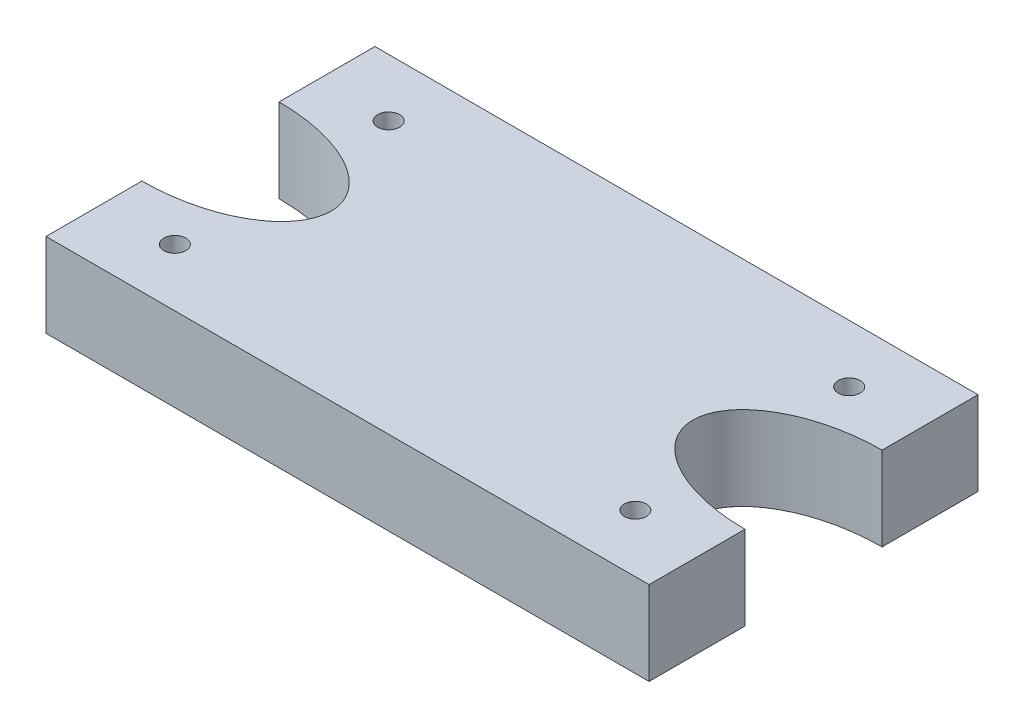
ISO-10303-21;
HEADER;
FILE_DESCRIPTION(('STEP AP214'),'2;1');
FILE_NAME('part.step','',(''),(''),'','','');
FILE_SCHEMA(('AUTOMOTIVE_DESIGN { 1 0 10303 214 1 1 1 1 }'));
ENDSEC;
DATA;
#1=APPLICATION_CONTEXT('core data for automotive mechanical design processes');
#2=APPLICATION_PROTOCOL_DEFINITION('international standard','automotive_design',2000,#1);
#3=PRODUCT_CONTEXT('',#1,'mechanical');
#4=PRODUCT('Part','Part','',(#3));
#5=PRODUCT_RELATED_PRODUCT_CATEGORY('part','',(#4));
#6=PRODUCT_DEFINITION_FORMATION('','',#4);
#7=PRODUCT_DEFINITION_CONTEXT('part definition',#1,'design');
#8=PRODUCT_DEFINITION('design','',#6,#7);
#9=PRODUCT_DEFINITION_SHAPE('','',#8);
#10=(LENGTH_UNIT() NAMED_UNIT(*) SI_UNIT(.MILLI.,.METRE.));
#11=(NAMED_UNIT(*) PLANE_ANGLE_UNIT() SI_UNIT($,.RADIAN.));
#12=(NAMED_UNIT(*) SI_UNIT($,.STERADIAN.) SOLID_ANGLE_UNIT());
#13=UNCERTAINTY_MEASURE_WITH_UNIT(LENGTH_MEASURE(1.E-05),#10,'distance_accuracy_value','');
#14=(GEOMETRIC_REPRESENTATION_CONTEXT(3) GLOBAL_UNCERTAINTY_ASSIGNED_CONTEXT((#13)) GLOBAL_UNIT_ASSIGNED_CONTEXT((#10,
#11,#12)) REPRESENTATION_CONTEXT('',''));
#15=CARTESIAN_POINT('',(0.,0.,0.));
#16=DIRECTION('',(0.,0.,1.));
#17=DIRECTION('',(1.,0.,0.));
#18=AXIS2_PLACEMENT_3D('',#15,#16,#17);
#19=CARTESIAN_POINT('',(74.7319959194584,15.3,-18.9703142417084));
#20=DIRECTION('',(-1.,0.,0.));
#21=DIRECTION('',(0.,0.,1.));
#22=AXIS2_PLACEMENT_3D('',#19,#20,#21);
#23=PLANE('',#22);
#24=DIRECTION('',(0.,0.,-1.));
#25=VECTOR('',#24,1.);
#26=CARTESIAN_POINT('',(74.7319959194584,0.,-18.9703142417084));
#27=LINE('',#26,#25);
#28=CARTESIAN_POINT('',(74.7319959194584,0.,41.0296857582915));
#29=VERTEX_POINT('',#28);
#30=CARTESIAN_POINT('',(74.7319959194584,0.,23.5296857582916));
#31=VERTEX_POINT('',#30);
#32=EDGE_CURVE('E114',#29,#31,#27,.T.);
#33=ORIENTED_EDGE('',*,*,#32,.T.);
#34=DIRECTION('',(0.,1.,0.));
#35=VECTOR('',#34,1.);
#36=CARTESIAN_POINT('',(74.7319959194584,0.,23.5296857582916));
#37=LINE('',#36,#35);
#38=CARTESIAN_POINT('',(74.7319959194584,15.3,23.5296857582916));
#39=VERTEX_POINT('',#38);
#40=EDGE_CURVE('E47',#31,#39,#37,.T.);
#41=ORIENTED_EDGE('',*,*,#40,.T.);
#42=DIRECTION('',(0.,0.,-1.));
#43=VECTOR('',#42,1.);
#44=CARTESIAN_POINT('',(74.7319959194584,15.3,-18.9703142417084));
#45=LINE('',#44,#43);
#46=CARTESIAN_POINT('',(74.7319959194584,15.3,41.0296857582915));
#47=VERTEX_POINT('',#46);
#48=EDGE_CURVE('E147',#47,#39,#45,.T.);
#49=ORIENTED_EDGE('',*,*,#48,.F.);
#50=DIRECTION('',(0.,-1.,0.));
#51=VECTOR('',#50,1.);
#52=CARTESIAN_POINT('',(74.7319959194584,15.3,41.0296857582915));
#53=LINE('',#52,#51);
#54=EDGE_CURVE('E129',#47,#29,#53,.T.);
#55=ORIENTED_EDGE('',*,*,#54,.T.);
#56=EDGE_LOOP('',(#33,#41,#49,#55));
#57=FACE_BOUND('',#56,.T.);
#58=ADVANCED_FACE('F32',(#57),#23,.F.);
#59=CARTESIAN_POINT('',(-35.2680040805416,15.3,-18.9703142417084));
#60=DIRECTION('',(1.,0.,0.));
#61=DIRECTION('',(0.,0.,-1.));
#62=AXIS2_PLACEMENT_3D('',#59,#60,#61);
#63=PLANE('',#62);
#64=DIRECTION('',(0.,0.,1.));
#65=VECTOR('',#64,1.);
#66=CARTESIAN_POINT('',(-35.2680040805416,0.,-18.9703142417084));
#67=LINE('',#66,#65);
#68=CARTESIAN_POINT('',(-35.2680040805416,0.,-18.9703142417084));
#69=VERTEX_POINT('',#68);
#70=CARTESIAN_POINT('',(-35.2680040805416,0.,-1.47031424170845));
#71=VERTEX_POINT('',#70);
#72=EDGE_CURVE('E117',#69,#71,#67,.T.);
#73=ORIENTED_EDGE('',*,*,#72,.T.);
#74=DIRECTION('',(0.,1.,0.));
#75=VECTOR('',#74,1.);
#76=CARTESIAN_POINT('',(-35.2680040805416,0.,-1.47031424170845));
#77=LINE('',#76,#75);
#78=CARTESIAN_POINT('',(-35.2680040805416,15.3,-1.47031424170845));
#79=VERTEX_POINT('',#78);
#80=EDGE_CURVE('E54',#71,#79,#77,.T.);
#81=ORIENTED_EDGE('',*,*,#80,.T.);
#82=DIRECTION('',(0.,0.,1.));
#83=VECTOR('',#82,1.);
#84=CARTESIAN_POINT('',(-35.2680040805416,15.3,-18.9703142417084));
#85=LINE('',#84,#83);
#86=CARTESIAN_POINT('',(-35.2680040805416,15.3,-18.9703142417084));
#87=VERTEX_POINT('',#86);
#88=EDGE_CURVE('E152',#87,#79,#85,.T.);
#89=ORIENTED_EDGE('',*,*,#88,.F.);
#90=DIRECTION('',(0.,-1.,0.));
#91=VECTOR('',#90,1.);
#92=CARTESIAN_POINT('',(-35.2680040805416,15.3,-18.9703142417084));
#93=LINE('',#92,#91);
#94=EDGE_CURVE('E123',#87,#69,#93,.T.);
#95=ORIENTED_EDGE('',*,*,#94,.T.);
#96=EDGE_LOOP('',(#73,#81,#89,#95));
#97=FACE_BOUND('',#96,.T.);
#98=ADVANCED_FACE('F140',(#97),#63,.F.);
#99=CARTESIAN_POINT('',(-35.2680040805416,15.3,23.5296857582916));
#100=VERTEX_POINT('',#99);
#101=CARTESIAN_POINT('',(-35.2680040805416,15.3,41.0296857582915));
#102=VERTEX_POINT('',#101);
#103=EDGE_CURVE('E122',#100,#102,#85,.T.);
#104=ORIENTED_EDGE('',*,*,#103,.F.);
#105=DIRECTION('',(0.,1.,0.));
#106=VECTOR('',#105,1.);
#107=CARTESIAN_POINT('',(-35.2680040805416,0.,23.5296857582916));
#108=LINE('',#107,#106);
#109=CARTESIAN_POINT('',(-35.2680040805416,0.,23.5296857582916));
#110=VERTEX_POINT('',#109);
#111=EDGE_CURVE('E178',#100,#110,#108,.F.);
#112=ORIENTED_EDGE('',*,*,#111,.T.);
#113=CARTESIAN_POINT('',(-35.2680040805416,0.,41.0296857582915));
#114=VERTEX_POINT('',#113);
#115=EDGE_CURVE('E137',#110,#114,#67,.T.);
#116=ORIENTED_EDGE('',*,*,#115,.T.);
#117=DIRECTION('',(0.,-1.,0.));
#118=VECTOR('',#117,1.);
#119=CARTESIAN_POINT('',(-35.2680040805416,15.3,41.0296857582915));
#120=LINE('',#119,#118);
#121=EDGE_CURVE('E132',#102,#114,#120,.T.);
#122=ORIENTED_EDGE('',*,*,#121,.F.);
#123=EDGE_LOOP('',(#104,#112,#116,#122));
#124=FACE_BOUND('',#123,.T.);
#125=ADVANCED_FACE('F34',(#124),#63,.F.);
#126=CARTESIAN_POINT('',(-35.2680040805416,15.3,41.0296857582915));
#127=DIRECTION('',(0.,0.,-1.));
#128=DIRECTION('',(-1.,0.,0.));
#129=AXIS2_PLACEMENT_3D('',#126,#127,#128);
#130=PLANE('',#129);
#131=DIRECTION('',(1.,0.,0.));
#132=VECTOR('',#131,1.);
#133=CARTESIAN_POINT('',(-35.2680040805416,0.,41.0296857582915));
#134=LINE('',#133,#132);
#135=EDGE_CURVE('E115',#114,#29,#134,.T.);
#136=ORIENTED_EDGE('',*,*,#135,.T.);
#137=ORIENTED_EDGE('',*,*,#54,.F.);
#138=DIRECTION('',(1.,0.,0.));
#139=VECTOR('',#138,1.);
#140=CARTESIAN_POINT('',(-35.2680040805416,15.3,41.0296857582915));
#141=LINE('',#140,#139);
#142=EDGE_CURVE('E150',#102,#47,#141,.T.);
#143=ORIENTED_EDGE('',*,*,#142,.F.);
#144=ORIENTED_EDGE('',*,*,#121,.T.);
#145=EDGE_LOOP('',(#136,#137,#143,#144));
#146=FACE_BOUND('',#145,.T.);
#147=ADVANCED_FACE('F218',(#146),#130,.F.);
#148=CARTESIAN_POINT('',(74.7319959194584,15.3,-1.47031424170845));
#149=VERTEX_POINT('',#148);
#150=CARTESIAN_POINT('',(74.7319959194584,15.3,-18.9703142417084));
#151=VERTEX_POINT('',#150);
#152=EDGE_CURVE('E107',#149,#151,#45,.T.);
#153=ORIENTED_EDGE('',*,*,#152,.F.);
#154=DIRECTION('',(0.,1.,0.));
#155=VECTOR('',#154,1.);
#156=CARTESIAN_POINT('',(74.7319959194584,0.,-1.47031424170845));
#157=LINE('',#156,#155);
#158=CARTESIAN_POINT('',(74.7319959194584,0.,-1.47031424170845));
#159=VERTEX_POINT('',#158);
#160=EDGE_CURVE('E95',#149,#159,#157,.F.);
#161=ORIENTED_EDGE('',*,*,#160,.T.);
#162=CARTESIAN_POINT('',(74.7319959194584,0.,-18.9703142417084));
#163=VERTEX_POINT('',#162);
#164=EDGE_CURVE('E105',#159,#163,#27,.T.);
#165=ORIENTED_EDGE('',*,*,#164,.T.);
#166=DIRECTION('',(0.,-1.,0.));
#167=VECTOR('',#166,1.);
#168=CARTESIAN_POINT('',(74.7319959194584,15.3,-18.9703142417084));
#169=LINE('',#168,#167);
#170=EDGE_CURVE('E126',#151,#163,#169,.T.);
#171=ORIENTED_EDGE('',*,*,#170,.F.);
#172=EDGE_LOOP('',(#153,#161,#165,#171));
#173=FACE_BOUND('',#172,.T.);
#174=ADVANCED_FACE('F103',(#173),#23,.F.);
#175=CARTESIAN_POINT('',(-35.2680040805416,15.3,-18.9703142417084));
#176=DIRECTION('',(0.,0.,1.));
#177=DIRECTION('',(1.,0.,0.));
#178=AXIS2_PLACEMENT_3D('',#175,#176,#177);
#179=PLANE('',#178);
#180=DIRECTION('',(-1.,0.,0.));
#181=VECTOR('',#180,1.);
#182=CARTESIAN_POINT('',(-35.2680040805416,0.,-18.9703142417084));
#183=LINE('',#182,#181);
#184=EDGE_CURVE('E113',#163,#69,#183,.T.);
#185=ORIENTED_EDGE('',*,*,#184,.T.);
#186=ORIENTED_EDGE('',*,*,#94,.F.);
#187=DIRECTION('',(-1.,0.,0.));
#188=VECTOR('',#187,1.);
#189=CARTESIAN_POINT('',(-35.2680040805416,15.3,-18.9703142417084));
#190=LINE('',#189,#188);
#191=EDGE_CURVE('E127',#151,#87,#190,.T.);
#192=ORIENTED_EDGE('',*,*,#191,.F.);
#193=ORIENTED_EDGE('',*,*,#170,.T.);
#194=EDGE_LOOP('',(#185,#186,#192,#193));
#195=FACE_BOUND('',#194,.T.);
#196=ADVANCED_FACE('F209',(#195),#179,.F.);
#197=CARTESIAN_POINT('',(0.,15.3,0.));
#198=DIRECTION('',(0.,1.,0.));
#199=DIRECTION('',(0.,0.,1.));
#200=AXIS2_PLACEMENT_3D('',#197,#198,#199);
#201=PLANE('',#200);
#202=CARTESIAN_POINT('',(74.7319959194584,15.3,11.0296857582916));
#203=DIRECTION('',(0.,1.,0.));
#204=DIRECTION('',(-1.,0.,0.));
#205=AXIS2_PLACEMENT_3D('',#202,#203,#204);
#206=ELLIPSE('',#205,22.,12.5);
#207=EDGE_CURVE('E108',#149,#39,#206,.T.);
#208=ORIENTED_EDGE('',*,*,#207,.F.);
#209=ORIENTED_EDGE('',*,*,#152,.T.);
#210=ORIENTED_EDGE('',*,*,#191,.T.);
#211=ORIENTED_EDGE('',*,*,#88,.T.);
#212=CARTESIAN_POINT('',(-35.2680040805416,15.3,11.0296857582916));
#213=DIRECTION('',(0.,1.,0.));
#214=DIRECTION('',(1.,0.,0.));
#215=AXIS2_PLACEMENT_3D('',#212,#213,#214);
#216=ELLIPSE('',#215,22.,12.5);
#217=EDGE_CURVE('E180',#100,#79,#216,.T.);
#218=ORIENTED_EDGE('',*,*,#217,.F.);
#219=ORIENTED_EDGE('',*,*,#103,.T.);
#220=ORIENTED_EDGE('',*,*,#142,.T.);
#221=ORIENTED_EDGE('',*,*,#48,.T.);
#222=EDGE_LOOP('',(#208,#209,#210,#211,#218,#219,#220,#221));
#223=FACE_BOUND('',#222,.T.);
#224=CARTESIAN_POINT('',(-22.2680040805416,15.3,30.5296857582915));
#225=DIRECTION('',(0.,1.,0.));
#226=DIRECTION('',(0.,0.,1.));
#227=AXIS2_PLACEMENT_3D('',#224,#225,#226);
#228=CIRCLE('',#227,2.);
#229=CARTESIAN_POINT('',(-22.2680040805416,15.3,32.5296857582915));
#230=VERTEX_POINT('',#229);
#231=EDGE_CURVE('E172',#230,#230,#228,.T.);
#232=ORIENTED_EDGE('',*,*,#231,.F.);
#233=EDGE_LOOP('',(#232));
#234=FACE_BOUND('',#233,.T.);
#235=CARTESIAN_POINT('',(-22.2680040805416,15.3,-8.47031424170845));
#236=DIRECTION('',(0.,1.,0.));
#237=DIRECTION('',(0.,0.,1.));
#238=AXIS2_PLACEMENT_3D('',#235,#236,#237);
#239=CIRCLE('',#238,2.);
#240=CARTESIAN_POINT('',(-22.2680040805416,15.3,-6.47031424170845));
#241=VERTEX_POINT('',#240);
#242=EDGE_CURVE('E166',#241,#241,#239,.T.);
#243=ORIENTED_EDGE('',*,*,#242,.F.);
#244=EDGE_LOOP('',(#243));
#245=FACE_BOUND('',#244,.T.);
#246=CARTESIAN_POINT('',(61.7319959194584,15.3,30.5296857582916));
#247=DIRECTION('',(0.,1.,0.));
#248=DIRECTION('',(0.,0.,1.));
#249=AXIS2_PLACEMENT_3D('',#246,#247,#248);
#250=CIRCLE('',#249,2.);
#251=CARTESIAN_POINT('',(61.7319959194584,15.3,32.5296857582915));
#252=VERTEX_POINT('',#251);
#253=EDGE_CURVE('E160',#252,#252,#250,.T.);
#254=ORIENTED_EDGE('',*,*,#253,.F.);
#255=EDGE_LOOP('',(#254));
#256=FACE_BOUND('',#255,.T.);
#257=CARTESIAN_POINT('',(61.7319959194584,15.3,-8.47031424170845));
#258=DIRECTION('',(0.,1.,0.));
#259=DIRECTION('',(0.,0.,1.));
#260=AXIS2_PLACEMENT_3D('',#257,#258,#259);
#261=CIRCLE('',#260,2.);
#262=CARTESIAN_POINT('',(61.7319959194584,15.3,-6.47031424170845));
#263=VERTEX_POINT('',#262);
#264=EDGE_CURVE('E154',#263,#263,#261,.T.);
#265=ORIENTED_EDGE('',*,*,#264,.F.);
#266=EDGE_LOOP('',(#265));
#267=FACE_BOUND('',#266,.T.);
#268=ADVANCED_FACE('F206',(#223,#234,#245,#256,#267),#201,.T.);
#269=CARTESIAN_POINT('',(0.,0.,0.));
#270=DIRECTION('',(0.,1.,0.));
#271=DIRECTION('',(0.,0.,1.));
#272=AXIS2_PLACEMENT_3D('',#269,#270,#271);
#273=PLANE('',#272);
#274=CARTESIAN_POINT('',(-22.2680040805416,0.,30.5296857582915));
#275=DIRECTION('',(0.,1.,0.));
#276=DIRECTION('',(0.,0.,1.));
#277=AXIS2_PLACEMENT_3D('',#274,#275,#276);
#278=CIRCLE('',#277,2.);
#279=CARTESIAN_POINT('',(-22.2680040805416,0.,32.5296857582915));
#280=VERTEX_POINT('',#279);
#281=EDGE_CURVE('E169',#280,#280,#278,.T.);
#282=ORIENTED_EDGE('',*,*,#281,.T.);
#283=EDGE_LOOP('',(#282));
#284=FACE_BOUND('',#283,.T.);
#285=CARTESIAN_POINT('',(-22.2680040805416,0.,-8.47031424170845));
#286=DIRECTION('',(0.,1.,0.));
#287=DIRECTION('',(0.,0.,1.));
#288=AXIS2_PLACEMENT_3D('',#285,#286,#287);
#289=CIRCLE('',#288,2.);
#290=CARTESIAN_POINT('',(-22.2680040805416,0.,-6.47031424170845));
#291=VERTEX_POINT('',#290);
#292=EDGE_CURVE('E163',#291,#291,#289,.T.);
#293=ORIENTED_EDGE('',*,*,#292,.T.);
#294=EDGE_LOOP('',(#293));
#295=FACE_BOUND('',#294,.T.);
#296=CARTESIAN_POINT('',(61.7319959194584,0.,30.5296857582916));
#297=DIRECTION('',(0.,1.,0.));
#298=DIRECTION('',(0.,0.,1.));
#299=AXIS2_PLACEMENT_3D('',#296,#297,#298);
#300=CIRCLE('',#299,2.);
#301=CARTESIAN_POINT('',(61.7319959194584,0.,32.5296857582915));
#302=VERTEX_POINT('',#301);
#303=EDGE_CURVE('E157',#302,#302,#300,.T.);
#304=ORIENTED_EDGE('',*,*,#303,.T.);
#305=EDGE_LOOP('',(#304));
#306=FACE_BOUND('',#305,.T.);
#307=CARTESIAN_POINT('',(61.7319959194584,0.,-8.47031424170845));
#308=DIRECTION('',(0.,1.,0.));
#309=DIRECTION('',(0.,0.,1.));
#310=AXIS2_PLACEMENT_3D('',#307,#308,#309);
#311=CIRCLE('',#310,2.);
#312=CARTESIAN_POINT('',(61.7319959194584,0.,-6.47031424170845));
#313=VERTEX_POINT('',#312);
#314=EDGE_CURVE('E144',#313,#313,#311,.T.);
#315=ORIENTED_EDGE('',*,*,#314,.T.);
#316=EDGE_LOOP('',(#315));
#317=FACE_BOUND('',#316,.T.);
#318=ORIENTED_EDGE('',*,*,#164,.F.);
#319=CARTESIAN_POINT('',(74.7319959194584,0.,11.0296857582916));
#320=DIRECTION('',(0.,1.,0.));
#321=DIRECTION('',(-1.,0.,0.));
#322=AXIS2_PLACEMENT_3D('',#319,#320,#321);
#323=ELLIPSE('',#322,22.,12.5);
#324=EDGE_CURVE('E11',#159,#31,#323,.T.);
#325=ORIENTED_EDGE('',*,*,#324,.T.);
#326=ORIENTED_EDGE('',*,*,#32,.F.);
#327=ORIENTED_EDGE('',*,*,#135,.F.);
#328=ORIENTED_EDGE('',*,*,#115,.F.);
#329=CARTESIAN_POINT('',(-35.2680040805416,0.,11.0296857582916));
#330=DIRECTION('',(0.,1.,0.));
#331=DIRECTION('',(1.,0.,0.));
#332=AXIS2_PLACEMENT_3D('',#329,#330,#331);
#333=ELLIPSE('',#332,22.,12.5);
#334=EDGE_CURVE('E40',#110,#71,#333,.T.);
#335=ORIENTED_EDGE('',*,*,#334,.T.);
#336=ORIENTED_EDGE('',*,*,#72,.F.);
#337=ORIENTED_EDGE('',*,*,#184,.F.);
#338=EDGE_LOOP('',(#318,#325,#326,#327,#328,#335,#336,#337));
#339=FACE_BOUND('',#338,.T.);
#340=ADVANCED_FACE('F111',(#284,#295,#306,#317,#339),#273,.F.);
#341=CARTESIAN_POINT('',(61.7319959194584,0.,-8.47031424170845));
#342=DIRECTION('',(0.,1.,0.));
#343=DIRECTION('',(0.,0.,1.));
#344=AXIS2_PLACEMENT_3D('',#341,#342,#343);
#345=CYLINDRICAL_SURFACE('',#344,2.);
#346=ORIENTED_EDGE('',*,*,#314,.F.);
#347=EDGE_LOOP('',(#346));
#348=FACE_BOUND('',#347,.T.);
#349=ORIENTED_EDGE('',*,*,#264,.T.);
#350=EDGE_LOOP('',(#349));
#351=FACE_BOUND('',#350,.T.);
#352=ADVANCED_FACE('F201',(#348,#351),#345,.F.);
#353=CARTESIAN_POINT('',(61.7319959194584,0.,30.5296857582916));
#354=DIRECTION('',(0.,1.,0.));
#355=DIRECTION('',(0.,0.,1.));
#356=AXIS2_PLACEMENT_3D('',#353,#354,#355);
#357=CYLINDRICAL_SURFACE('',#356,2.);
#358=ORIENTED_EDGE('',*,*,#303,.F.);
#359=EDGE_LOOP('',(#358));
#360=FACE_BOUND('',#359,.T.);
#361=ORIENTED_EDGE('',*,*,#253,.T.);
#362=EDGE_LOOP('',(#361));
#363=FACE_BOUND('',#362,.T.);
#364=ADVANCED_FACE('F197',(#360,#363),#357,.F.);
#365=CARTESIAN_POINT('',(-22.2680040805416,0.,-8.47031424170845));
#366=DIRECTION('',(0.,1.,0.));
#367=DIRECTION('',(0.,0.,1.));
#368=AXIS2_PLACEMENT_3D('',#365,#366,#367);
#369=CYLINDRICAL_SURFACE('',#368,2.);
#370=ORIENTED_EDGE('',*,*,#292,.F.);
#371=EDGE_LOOP('',(#370));
#372=FACE_BOUND('',#371,.T.);
#373=ORIENTED_EDGE('',*,*,#242,.T.);
#374=EDGE_LOOP('',(#373));
#375=FACE_BOUND('',#374,.T.);
#376=ADVANCED_FACE('F193',(#372,#375),#369,.F.);
#377=CARTESIAN_POINT('',(-22.2680040805416,0.,30.5296857582915));
#378=DIRECTION('',(0.,1.,0.));
#379=DIRECTION('',(0.,0.,1.));
#380=AXIS2_PLACEMENT_3D('',#377,#378,#379);
#381=CYLINDRICAL_SURFACE('',#380,2.);
#382=ORIENTED_EDGE('',*,*,#281,.F.);
#383=EDGE_LOOP('',(#382));
#384=FACE_BOUND('',#383,.T.);
#385=ORIENTED_EDGE('',*,*,#231,.T.);
#386=EDGE_LOOP('',(#385));
#387=FACE_BOUND('',#386,.T.);
#388=ADVANCED_FACE('F189',(#384,#387),#381,.F.);
#389=CARTESIAN_POINT('',(-35.2680040805416,0.,11.0296857582916));
#390=DIRECTION('',(0.,1.,0.));
#391=DIRECTION('',(1.,0.,0.));
#392=AXIS2_PLACEMENT_3D('',#389,#390,#391);
#393=ELLIPSE('',#392,22.,12.5);
#394=DIRECTION('',(0.,1.,0.));
#395=VECTOR('',#394,1.);
#396=SURFACE_OF_LINEAR_EXTRUSION('',#393,#395);
#397=ORIENTED_EDGE('',*,*,#334,.F.);
#398=ORIENTED_EDGE('',*,*,#111,.F.);
#399=ORIENTED_EDGE('',*,*,#217,.T.);
#400=ORIENTED_EDGE('',*,*,#80,.F.);
#401=EDGE_LOOP('',(#397,#398,#399,#400));
#402=FACE_BOUND('',#401,.T.);
#403=ADVANCED_FACE('F185',(#402),#396,.F.);
#404=CARTESIAN_POINT('',(74.7319959194584,0.,11.0296857582916));
#405=DIRECTION('',(0.,1.,0.));
#406=DIRECTION('',(-1.,0.,0.));
#407=AXIS2_PLACEMENT_3D('',#404,#405,#406);
#408=ELLIPSE('',#407,22.,12.5);
#409=DIRECTION('',(0.,1.,0.));
#410=VECTOR('',#409,1.);
#411=SURFACE_OF_LINEAR_EXTRUSION('',#408,#410);
#412=ORIENTED_EDGE('',*,*,#324,.F.);
#413=ORIENTED_EDGE('',*,*,#160,.F.);
#414=ORIENTED_EDGE('',*,*,#207,.T.);
#415=ORIENTED_EDGE('',*,*,#40,.F.);
#416=EDGE_LOOP('',(#412,#413,#414,#415));
#417=FACE_BOUND('',#416,.T.);
#418=ADVANCED_FACE('F94',(#417),#411,.F.);
#419=CLOSED_SHELL('',(#58,#98,#125,#147,#174,#196,#268,#340,#352,#364,#376,#388,#403,#418));
#420=MANIFOLD_SOLID_BREP('B2',#419);
#421=ADVANCED_BREP_SHAPE_REPRESENTATION('',(#18,#420),#14);
#422=SHAPE_DEFINITION_REPRESENTATION(#9,#421);
ENDSEC;
END-ISO-10303-21;
